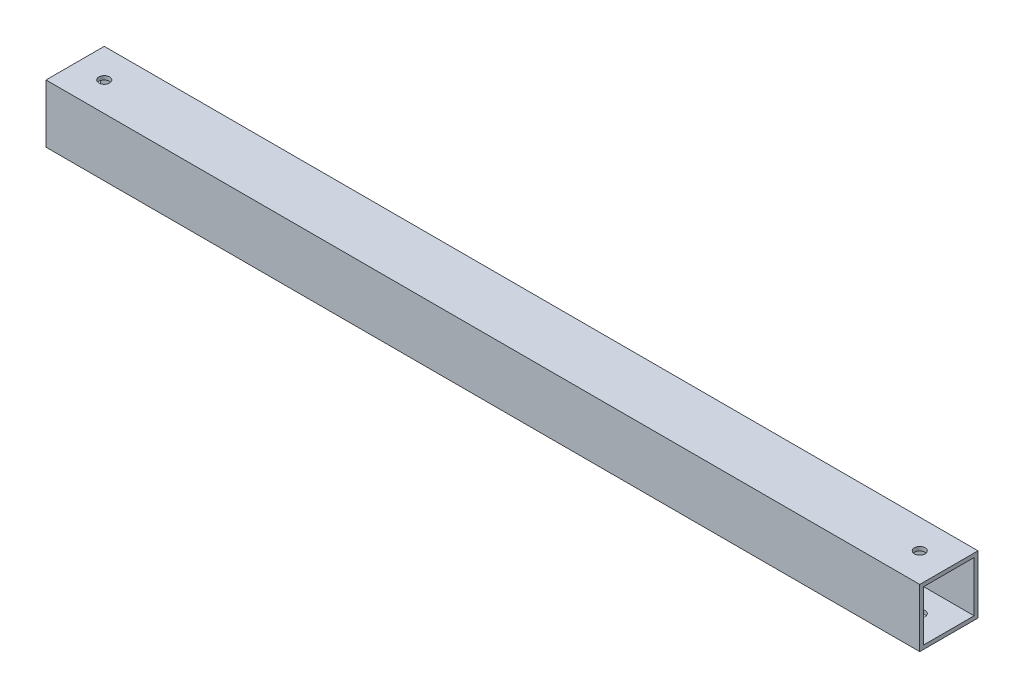
ISO-10303-21;
HEADER;
FILE_DESCRIPTION(('STEP AP214'),'2;1');
FILE_NAME('part.step','',(''),(''),'','','');
FILE_SCHEMA(('AUTOMOTIVE_DESIGN { 1 0 10303 214 1 1 1 1 }'));
ENDSEC;
DATA;
#1=APPLICATION_CONTEXT('core data for automotive mechanical design processes');
#2=APPLICATION_PROTOCOL_DEFINITION('international standard','automotive_design',2000,#1);
#3=PRODUCT_CONTEXT('',#1,'mechanical');
#4=PRODUCT('Part','Part','',(#3));
#5=PRODUCT_RELATED_PRODUCT_CATEGORY('part','',(#4));
#6=PRODUCT_DEFINITION_FORMATION('','',#4);
#7=PRODUCT_DEFINITION_CONTEXT('part definition',#1,'design');
#8=PRODUCT_DEFINITION('design','',#6,#7);
#9=PRODUCT_DEFINITION_SHAPE('','',#8);
#10=(LENGTH_UNIT() NAMED_UNIT(*) SI_UNIT(.MILLI.,.METRE.));
#11=(NAMED_UNIT(*) PLANE_ANGLE_UNIT() SI_UNIT($,.RADIAN.));
#12=(NAMED_UNIT(*) SI_UNIT($,.STERADIAN.) SOLID_ANGLE_UNIT());
#13=UNCERTAINTY_MEASURE_WITH_UNIT(LENGTH_MEASURE(1.E-05),#10,'distance_accuracy_value','');
#14=(GEOMETRIC_REPRESENTATION_CONTEXT(3) GLOBAL_UNCERTAINTY_ASSIGNED_CONTEXT((#13)) GLOBAL_UNIT_ASSIGNED_CONTEXT((#10,
#11,#12)) REPRESENTATION_CONTEXT('',''));
#15=CARTESIAN_POINT('',(0.,0.,0.));
#16=DIRECTION('',(0.,0.,1.));
#17=DIRECTION('',(1.,0.,0.));
#18=AXIS2_PLACEMENT_3D('',#15,#16,#17);
#19=CARTESIAN_POINT('',(225.,0.,0.));
#20=DIRECTION('',(-1.,0.,0.));
#21=DIRECTION('',(0.,0.,1.));
#22=AXIS2_PLACEMENT_3D('',#19,#20,#21);
#23=PLANE('',#22);
#24=DIRECTION('',(0.,-1.,0.));
#25=VECTOR('',#24,1.);
#26=CARTESIAN_POINT('',(225.,15.,15.));
#27=LINE('',#26,#25);
#28=CARTESIAN_POINT('',(225.,15.,15.));
#29=VERTEX_POINT('',#28);
#30=CARTESIAN_POINT('',(225.,-15.,15.));
#31=VERTEX_POINT('',#30);
#32=EDGE_CURVE('E157',#29,#31,#27,.T.);
#33=ORIENTED_EDGE('',*,*,#32,.T.);
#34=DIRECTION('',(0.,0.,-1.));
#35=VECTOR('',#34,1.);
#36=CARTESIAN_POINT('',(225.,-15.,-15.));
#37=LINE('',#36,#35);
#38=CARTESIAN_POINT('',(225.,-15.,-15.));
#39=VERTEX_POINT('',#38);
#40=EDGE_CURVE('E161',#31,#39,#37,.T.);
#41=ORIENTED_EDGE('',*,*,#40,.T.);
#42=DIRECTION('',(0.,1.,0.));
#43=VECTOR('',#42,1.);
#44=CARTESIAN_POINT('',(225.,15.,-15.));
#45=LINE('',#44,#43);
#46=CARTESIAN_POINT('',(225.,15.,-15.));
#47=VERTEX_POINT('',#46);
#48=EDGE_CURVE('E165',#39,#47,#45,.T.);
#49=ORIENTED_EDGE('',*,*,#48,.T.);
#50=DIRECTION('',(0.,0.,1.));
#51=VECTOR('',#50,1.);
#52=CARTESIAN_POINT('',(225.,15.,-15.));
#53=LINE('',#52,#51);
#54=EDGE_CURVE('E168',#47,#29,#53,.T.);
#55=ORIENTED_EDGE('',*,*,#54,.T.);
#56=EDGE_LOOP('',(#33,#41,#49,#55));
#57=FACE_BOUND('',#56,.T.);
#58=DIRECTION('',(0.,1.,0.));
#59=VECTOR('',#58,1.);
#60=CARTESIAN_POINT('',(225.,13.,-13.));
#61=LINE('',#60,#59);
#62=CARTESIAN_POINT('',(225.,-13.,-13.));
#63=VERTEX_POINT('',#62);
#64=CARTESIAN_POINT('',(225.,13.,-13.));
#65=VERTEX_POINT('',#64);
#66=EDGE_CURVE('E107',#63,#65,#61,.T.);
#67=ORIENTED_EDGE('',*,*,#66,.F.);
#68=DIRECTION('',(0.,0.,-1.));
#69=VECTOR('',#68,1.);
#70=CARTESIAN_POINT('',(225.,-13.,13.));
#71=LINE('',#70,#69);
#72=CARTESIAN_POINT('',(225.,-13.,13.));
#73=VERTEX_POINT('',#72);
#74=EDGE_CURVE('E133',#73,#63,#71,.T.);
#75=ORIENTED_EDGE('',*,*,#74,.F.);
#76=DIRECTION('',(0.,-1.,0.));
#77=VECTOR('',#76,1.);
#78=CARTESIAN_POINT('',(225.,13.,13.));
#79=LINE('',#78,#77);
#80=CARTESIAN_POINT('',(225.,13.,13.));
#81=VERTEX_POINT('',#80);
#82=EDGE_CURVE('E129',#81,#73,#79,.T.);
#83=ORIENTED_EDGE('',*,*,#82,.F.);
#84=DIRECTION('',(0.,0.,1.));
#85=VECTOR('',#84,1.);
#86=CARTESIAN_POINT('',(225.,13.,13.));
#87=LINE('',#86,#85);
#88=EDGE_CURVE('E116',#65,#81,#87,.T.);
#89=ORIENTED_EDGE('',*,*,#88,.F.);
#90=EDGE_LOOP('',(#67,#75,#83,#89));
#91=FACE_BOUND('',#90,.T.);
#92=ADVANCED_FACE('F39',(#57,#91),#23,.F.);
#93=CARTESIAN_POINT('',(-225.,0.,0.));
#94=DIRECTION('',(-1.,0.,0.));
#95=DIRECTION('',(0.,0.,1.));
#96=AXIS2_PLACEMENT_3D('',#93,#94,#95);
#97=PLANE('',#96);
#98=DIRECTION('',(0.,-1.,0.));
#99=VECTOR('',#98,1.);
#100=CARTESIAN_POINT('',(-225.,15.,15.));
#101=LINE('',#100,#99);
#102=CARTESIAN_POINT('',(-225.,15.,15.));
#103=VERTEX_POINT('',#102);
#104=CARTESIAN_POINT('',(-225.,-15.,15.));
#105=VERTEX_POINT('',#104);
#106=EDGE_CURVE('E125',#103,#105,#101,.T.);
#107=ORIENTED_EDGE('',*,*,#106,.F.);
#108=DIRECTION('',(0.,0.,1.));
#109=VECTOR('',#108,1.);
#110=CARTESIAN_POINT('',(-225.,15.,-15.));
#111=LINE('',#110,#109);
#112=CARTESIAN_POINT('',(-225.,15.,-15.));
#113=VERTEX_POINT('',#112);
#114=EDGE_CURVE('E162',#113,#103,#111,.T.);
#115=ORIENTED_EDGE('',*,*,#114,.F.);
#116=DIRECTION('',(0.,1.,0.));
#117=VECTOR('',#116,1.);
#118=CARTESIAN_POINT('',(-225.,15.,-15.));
#119=LINE('',#118,#117);
#120=CARTESIAN_POINT('',(-225.,-15.,-15.));
#121=VERTEX_POINT('',#120);
#122=EDGE_CURVE('E178',#121,#113,#119,.T.);
#123=ORIENTED_EDGE('',*,*,#122,.F.);
#124=DIRECTION('',(0.,0.,-1.));
#125=VECTOR('',#124,1.);
#126=CARTESIAN_POINT('',(-225.,-15.,-15.));
#127=LINE('',#126,#125);
#128=EDGE_CURVE('E175',#105,#121,#127,.T.);
#129=ORIENTED_EDGE('',*,*,#128,.F.);
#130=EDGE_LOOP('',(#107,#115,#123,#129));
#131=FACE_BOUND('',#130,.T.);
#132=DIRECTION('',(0.,0.,-1.));
#133=VECTOR('',#132,1.);
#134=CARTESIAN_POINT('',(-225.,-13.,13.));
#135=LINE('',#134,#133);
#136=CARTESIAN_POINT('',(-225.,-13.,13.));
#137=VERTEX_POINT('',#136);
#138=CARTESIAN_POINT('',(-225.,-13.,-13.));
#139=VERTEX_POINT('',#138);
#140=EDGE_CURVE('E117',#137,#139,#135,.T.);
#141=ORIENTED_EDGE('',*,*,#140,.T.);
#142=DIRECTION('',(0.,1.,0.));
#143=VECTOR('',#142,1.);
#144=CARTESIAN_POINT('',(-225.,13.,-13.));
#145=LINE('',#144,#143);
#146=CARTESIAN_POINT('',(-225.,13.,-13.));
#147=VERTEX_POINT('',#146);
#148=EDGE_CURVE('E65',#139,#147,#145,.T.);
#149=ORIENTED_EDGE('',*,*,#148,.T.);
#150=DIRECTION('',(0.,0.,1.));
#151=VECTOR('',#150,1.);
#152=CARTESIAN_POINT('',(-225.,13.,13.));
#153=LINE('',#152,#151);
#154=CARTESIAN_POINT('',(-225.,13.,13.));
#155=VERTEX_POINT('',#154);
#156=EDGE_CURVE('E123',#147,#155,#153,.T.);
#157=ORIENTED_EDGE('',*,*,#156,.T.);
#158=DIRECTION('',(0.,-1.,0.));
#159=VECTOR('',#158,1.);
#160=CARTESIAN_POINT('',(-225.,13.,13.));
#161=LINE('',#160,#159);
#162=EDGE_CURVE('E144',#155,#137,#161,.T.);
#163=ORIENTED_EDGE('',*,*,#162,.T.);
#164=EDGE_LOOP('',(#141,#149,#157,#163));
#165=FACE_BOUND('',#164,.T.);
#166=ADVANCED_FACE('F239',(#131,#165),#97,.T.);
#167=CARTESIAN_POINT('',(225.,15.,15.));
#168=DIRECTION('',(0.,0.,-1.));
#169=DIRECTION('',(0.,1.,0.));
#170=AXIS2_PLACEMENT_3D('',#167,#168,#169);
#171=PLANE('',#170);
#172=ORIENTED_EDGE('',*,*,#106,.T.);
#173=DIRECTION('',(-1.,0.,0.));
#174=VECTOR('',#173,1.);
#175=CARTESIAN_POINT('',(225.,-15.,15.));
#176=LINE('',#175,#174);
#177=EDGE_CURVE('E11',#31,#105,#176,.T.);
#178=ORIENTED_EDGE('',*,*,#177,.F.);
#179=ORIENTED_EDGE('',*,*,#32,.F.);
#180=DIRECTION('',(-1.,0.,0.));
#181=VECTOR('',#180,1.);
#182=CARTESIAN_POINT('',(225.,15.,15.));
#183=LINE('',#182,#181);
#184=EDGE_CURVE('E171',#29,#103,#183,.T.);
#185=ORIENTED_EDGE('',*,*,#184,.T.);
#186=EDGE_LOOP('',(#172,#178,#179,#185));
#187=FACE_BOUND('',#186,.T.);
#188=ADVANCED_FACE('F41',(#187),#171,.F.);
#189=CARTESIAN_POINT('',(225.,-15.,-15.));
#190=DIRECTION('',(0.,1.,0.));
#191=DIRECTION('',(0.,0.,1.));
#192=AXIS2_PLACEMENT_3D('',#189,#190,#191);
#193=PLANE('',#192);
#194=CARTESIAN_POINT('',(-210.,-15.,0.));
#195=DIRECTION('',(0.,-1.,0.));
#196=DIRECTION('',(0.,0.,1.));
#197=AXIS2_PLACEMENT_3D('',#194,#195,#196);
#198=CIRCLE('',#197,2.75000000000001);
#199=CARTESIAN_POINT('',(-210.,-15.,2.75000000000001));
#200=VERTEX_POINT('',#199);
#201=EDGE_CURVE('E214',#200,#200,#198,.T.);
#202=ORIENTED_EDGE('',*,*,#201,.F.);
#203=EDGE_LOOP('',(#202));
#204=FACE_BOUND('',#203,.T.);
#205=CARTESIAN_POINT('',(210.,-15.,0.));
#206=DIRECTION('',(0.,1.,0.));
#207=DIRECTION('',(0.,0.,1.));
#208=AXIS2_PLACEMENT_3D('',#205,#206,#207);
#209=CIRCLE('',#208,2.75000000000001);
#210=CARTESIAN_POINT('',(210.,-15.,2.75000000000001));
#211=VERTEX_POINT('',#210);
#212=EDGE_CURVE('E195',#211,#211,#209,.T.);
#213=ORIENTED_EDGE('',*,*,#212,.T.);
#214=EDGE_LOOP('',(#213));
#215=FACE_BOUND('',#214,.T.);
#216=ORIENTED_EDGE('',*,*,#128,.T.);
#217=DIRECTION('',(-1.,0.,0.));
#218=VECTOR('',#217,1.);
#219=CARTESIAN_POINT('',(225.,-15.,-15.));
#220=LINE('',#219,#218);
#221=EDGE_CURVE('E49',#39,#121,#220,.T.);
#222=ORIENTED_EDGE('',*,*,#221,.F.);
#223=ORIENTED_EDGE('',*,*,#40,.F.);
#224=ORIENTED_EDGE('',*,*,#177,.T.);
#225=EDGE_LOOP('',(#216,#222,#223,#224));
#226=FACE_BOUND('',#225,.T.);
#227=ADVANCED_FACE('F254',(#204,#215,#226),#193,.F.);
#228=CARTESIAN_POINT('',(225.,15.,-15.));
#229=DIRECTION('',(0.,0.,1.));
#230=DIRECTION('',(0.,-1.,0.));
#231=AXIS2_PLACEMENT_3D('',#228,#229,#230);
#232=PLANE('',#231);
#233=ORIENTED_EDGE('',*,*,#122,.T.);
#234=DIRECTION('',(-1.,0.,0.));
#235=VECTOR('',#234,1.);
#236=CARTESIAN_POINT('',(225.,15.,-15.));
#237=LINE('',#236,#235);
#238=EDGE_CURVE('E186',#47,#113,#237,.T.);
#239=ORIENTED_EDGE('',*,*,#238,.F.);
#240=ORIENTED_EDGE('',*,*,#48,.F.);
#241=ORIENTED_EDGE('',*,*,#221,.T.);
#242=EDGE_LOOP('',(#233,#239,#240,#241));
#243=FACE_BOUND('',#242,.T.);
#244=ADVANCED_FACE('F252',(#243),#232,.F.);
#245=CARTESIAN_POINT('',(225.,15.,-15.));
#246=DIRECTION('',(0.,-1.,0.));
#247=DIRECTION('',(0.,0.,-1.));
#248=AXIS2_PLACEMENT_3D('',#245,#246,#247);
#249=PLANE('',#248);
#250=CARTESIAN_POINT('',(-210.,15.,0.));
#251=DIRECTION('',(0.,-1.,0.));
#252=DIRECTION('',(0.,0.,1.));
#253=AXIS2_PLACEMENT_3D('',#250,#251,#252);
#254=CIRCLE('',#253,2.75000000000001);
#255=CARTESIAN_POINT('',(-210.,15.,2.75000000000001));
#256=VERTEX_POINT('',#255);
#257=EDGE_CURVE('E218',#256,#256,#254,.T.);
#258=ORIENTED_EDGE('',*,*,#257,.T.);
#259=EDGE_LOOP('',(#258));
#260=FACE_BOUND('',#259,.T.);
#261=CARTESIAN_POINT('',(210.,15.,0.));
#262=DIRECTION('',(0.,1.,0.));
#263=DIRECTION('',(0.,0.,1.));
#264=AXIS2_PLACEMENT_3D('',#261,#262,#263);
#265=CIRCLE('',#264,2.75000000000001);
#266=CARTESIAN_POINT('',(210.,15.,2.75000000000001));
#267=VERTEX_POINT('',#266);
#268=EDGE_CURVE('E202',#267,#267,#265,.T.);
#269=ORIENTED_EDGE('',*,*,#268,.F.);
#270=EDGE_LOOP('',(#269));
#271=FACE_BOUND('',#270,.T.);
#272=ORIENTED_EDGE('',*,*,#114,.T.);
#273=ORIENTED_EDGE('',*,*,#184,.F.);
#274=ORIENTED_EDGE('',*,*,#54,.F.);
#275=ORIENTED_EDGE('',*,*,#238,.T.);
#276=EDGE_LOOP('',(#272,#273,#274,#275));
#277=FACE_BOUND('',#276,.T.);
#278=ADVANCED_FACE('F223',(#260,#271,#277),#249,.F.);
#279=CARTESIAN_POINT('',(225.,13.,-13.));
#280=DIRECTION('',(0.,0.,1.));
#281=DIRECTION('',(1.,0.,0.));
#282=AXIS2_PLACEMENT_3D('',#279,#280,#281);
#283=PLANE('',#282);
#284=ORIENTED_EDGE('',*,*,#148,.F.);
#285=DIRECTION('',(-1.,0.,0.));
#286=VECTOR('',#285,1.);
#287=CARTESIAN_POINT('',(225.,-13.,-13.));
#288=LINE('',#287,#286);
#289=EDGE_CURVE('E111',#63,#139,#288,.T.);
#290=ORIENTED_EDGE('',*,*,#289,.F.);
#291=ORIENTED_EDGE('',*,*,#66,.T.);
#292=DIRECTION('',(-1.,0.,0.));
#293=VECTOR('',#292,1.);
#294=CARTESIAN_POINT('',(225.,13.,-13.));
#295=LINE('',#294,#293);
#296=EDGE_CURVE('E110',#65,#147,#295,.T.);
#297=ORIENTED_EDGE('',*,*,#296,.T.);
#298=EDGE_LOOP('',(#284,#290,#291,#297));
#299=FACE_BOUND('',#298,.T.);
#300=ADVANCED_FACE('F109',(#299),#283,.T.);
#301=CARTESIAN_POINT('',(225.,13.,13.));
#302=DIRECTION('',(0.,-1.,0.));
#303=DIRECTION('',(0.,0.,-1.));
#304=AXIS2_PLACEMENT_3D('',#301,#302,#303);
#305=PLANE('',#304);
#306=CARTESIAN_POINT('',(-210.,13.,0.));
#307=DIRECTION('',(0.,-1.,0.));
#308=DIRECTION('',(0.,0.,-1.));
#309=AXIS2_PLACEMENT_3D('',#306,#307,#308);
#310=CIRCLE('',#309,2.75000000000001);
#311=CARTESIAN_POINT('',(-210.,13.,-2.75000000000001));
#312=VERTEX_POINT('',#311);
#313=EDGE_CURVE('E208',#312,#312,#310,.F.);
#314=ORIENTED_EDGE('',*,*,#313,.T.);
#315=EDGE_LOOP('',(#314));
#316=FACE_BOUND('',#315,.T.);
#317=CARTESIAN_POINT('',(210.,13.,0.));
#318=DIRECTION('',(0.,-1.,0.));
#319=DIRECTION('',(0.,0.,-1.));
#320=AXIS2_PLACEMENT_3D('',#317,#318,#319);
#321=CIRCLE('',#320,2.75000000000001);
#322=CARTESIAN_POINT('',(210.,13.,-2.75000000000001));
#323=VERTEX_POINT('',#322);
#324=EDGE_CURVE('E141',#323,#323,#321,.T.);
#325=ORIENTED_EDGE('',*,*,#324,.F.);
#326=EDGE_LOOP('',(#325));
#327=FACE_BOUND('',#326,.T.);
#328=ORIENTED_EDGE('',*,*,#156,.F.);
#329=ORIENTED_EDGE('',*,*,#296,.F.);
#330=ORIENTED_EDGE('',*,*,#88,.T.);
#331=DIRECTION('',(-1.,0.,0.));
#332=VECTOR('',#331,1.);
#333=CARTESIAN_POINT('',(225.,13.,13.));
#334=LINE('',#333,#332);
#335=EDGE_CURVE('E126',#81,#155,#334,.T.);
#336=ORIENTED_EDGE('',*,*,#335,.T.);
#337=EDGE_LOOP('',(#328,#329,#330,#336));
#338=FACE_BOUND('',#337,.T.);
#339=ADVANCED_FACE('F120',(#316,#327,#338),#305,.T.);
#340=CARTESIAN_POINT('',(225.,13.,13.));
#341=DIRECTION('',(0.,0.,-1.));
#342=DIRECTION('',(-1.,0.,0.));
#343=AXIS2_PLACEMENT_3D('',#340,#341,#342);
#344=PLANE('',#343);
#345=ORIENTED_EDGE('',*,*,#162,.F.);
#346=ORIENTED_EDGE('',*,*,#335,.F.);
#347=ORIENTED_EDGE('',*,*,#82,.T.);
#348=DIRECTION('',(-1.,0.,0.));
#349=VECTOR('',#348,1.);
#350=CARTESIAN_POINT('',(225.,-13.,13.));
#351=LINE('',#350,#349);
#352=EDGE_CURVE('E57',#73,#137,#351,.T.);
#353=ORIENTED_EDGE('',*,*,#352,.T.);
#354=EDGE_LOOP('',(#345,#346,#347,#353));
#355=FACE_BOUND('',#354,.T.);
#356=ADVANCED_FACE('F280',(#355),#344,.T.);
#357=CARTESIAN_POINT('',(225.,-13.,13.));
#358=DIRECTION('',(0.,1.,0.));
#359=DIRECTION('',(0.,0.,1.));
#360=AXIS2_PLACEMENT_3D('',#357,#358,#359);
#361=PLANE('',#360);
#362=CARTESIAN_POINT('',(-210.,-13.,0.));
#363=DIRECTION('',(0.,1.,0.));
#364=DIRECTION('',(0.,0.,1.));
#365=AXIS2_PLACEMENT_3D('',#362,#363,#364);
#366=CIRCLE('',#365,2.75000000000001);
#367=CARTESIAN_POINT('',(-210.,-13.,2.75000000000001));
#368=VERTEX_POINT('',#367);
#369=EDGE_CURVE('E43',#368,#368,#366,.F.);
#370=ORIENTED_EDGE('',*,*,#369,.T.);
#371=EDGE_LOOP('',(#370));
#372=FACE_BOUND('',#371,.T.);
#373=CARTESIAN_POINT('',(210.,-13.,0.));
#374=DIRECTION('',(0.,1.,0.));
#375=DIRECTION('',(0.,0.,1.));
#376=AXIS2_PLACEMENT_3D('',#373,#374,#375);
#377=CIRCLE('',#376,2.75000000000001);
#378=CARTESIAN_POINT('',(210.,-13.,2.75000000000001));
#379=VERTEX_POINT('',#378);
#380=EDGE_CURVE('E192',#379,#379,#377,.T.);
#381=ORIENTED_EDGE('',*,*,#380,.F.);
#382=EDGE_LOOP('',(#381));
#383=FACE_BOUND('',#382,.T.);
#384=ORIENTED_EDGE('',*,*,#140,.F.);
#385=ORIENTED_EDGE('',*,*,#352,.F.);
#386=ORIENTED_EDGE('',*,*,#74,.T.);
#387=ORIENTED_EDGE('',*,*,#289,.T.);
#388=EDGE_LOOP('',(#384,#385,#386,#387));
#389=FACE_BOUND('',#388,.T.);
#390=ADVANCED_FACE('F277',(#372,#383,#389),#361,.T.);
#391=CARTESIAN_POINT('',(210.,-15.,0.));
#392=DIRECTION('',(0.,1.,0.));
#393=DIRECTION('',(0.,0.,1.));
#394=AXIS2_PLACEMENT_3D('',#391,#392,#393);
#395=CYLINDRICAL_SURFACE('',#394,2.75000000000001);
#396=ORIENTED_EDGE('',*,*,#380,.T.);
#397=EDGE_LOOP('',(#396));
#398=FACE_BOUND('',#397,.T.);
#399=ORIENTED_EDGE('',*,*,#212,.F.);
#400=EDGE_LOOP('',(#399));
#401=FACE_BOUND('',#400,.T.);
#402=ADVANCED_FACE('F279',(#398,#401),#395,.F.);
#403=ORIENTED_EDGE('',*,*,#324,.T.);
#404=EDGE_LOOP('',(#403));
#405=FACE_BOUND('',#404,.T.);
#406=ORIENTED_EDGE('',*,*,#268,.T.);
#407=EDGE_LOOP('',(#406));
#408=FACE_BOUND('',#407,.T.);
#409=ADVANCED_FACE('F234',(#405,#408),#395,.F.);
#410=CARTESIAN_POINT('',(-210.,-15.,0.));
#411=DIRECTION('',(0.,1.,0.));
#412=DIRECTION('',(0.,0.,1.));
#413=AXIS2_PLACEMENT_3D('',#410,#411,#412);
#414=CYLINDRICAL_SURFACE('',#413,2.75000000000001);
#415=ORIENTED_EDGE('',*,*,#369,.F.);
#416=EDGE_LOOP('',(#415));
#417=FACE_BOUND('',#416,.T.);
#418=ORIENTED_EDGE('',*,*,#201,.T.);
#419=EDGE_LOOP('',(#418));
#420=FACE_BOUND('',#419,.T.);
#421=ADVANCED_FACE('F228',(#417,#420),#414,.F.);
#422=ORIENTED_EDGE('',*,*,#313,.F.);
#423=EDGE_LOOP('',(#422));
#424=FACE_BOUND('',#423,.T.);
#425=ORIENTED_EDGE('',*,*,#257,.F.);
#426=EDGE_LOOP('',(#425));
#427=FACE_BOUND('',#426,.T.);
#428=ADVANCED_FACE('F226',(#424,#427),#414,.F.);
#429=CLOSED_SHELL('',(#92,#166,#188,#227,#244,#278,#300,#339,#356,#390,#402,#409,#421,#428));
#430=MANIFOLD_SOLID_BREP('B2',#429);
#431=ADVANCED_BREP_SHAPE_REPRESENTATION('',(#18,#430),#14);
#432=SHAPE_DEFINITION_REPRESENTATION(#9,#431);
ENDSEC;
END-ISO-10303-21;
